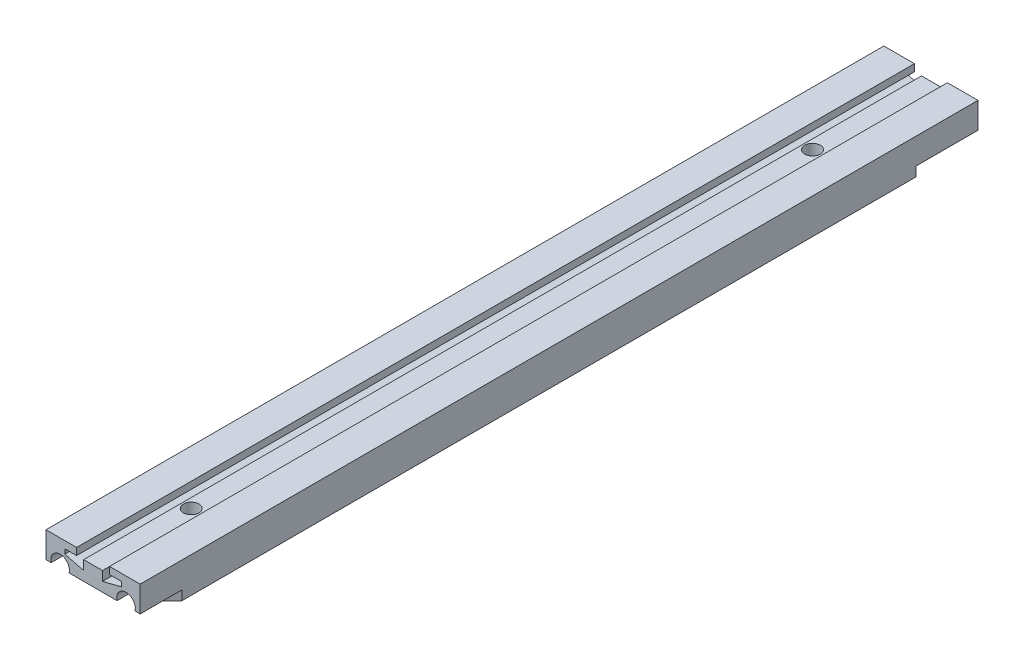
ISO-10303-21;
HEADER;
FILE_DESCRIPTION(('STEP AP214'),'2;1');
FILE_NAME('part.step','',(''),(''),'','','');
FILE_SCHEMA(('AUTOMOTIVE_DESIGN { 1 0 10303 214 1 1 1 1 }'));
ENDSEC;
DATA;
#1=APPLICATION_CONTEXT('core data for automotive mechanical design processes');
#2=APPLICATION_PROTOCOL_DEFINITION('international standard','automotive_design',2000,#1);
#3=PRODUCT_CONTEXT('',#1,'mechanical');
#4=PRODUCT('Part','Part','',(#3));
#5=PRODUCT_RELATED_PRODUCT_CATEGORY('part','',(#4));
#6=PRODUCT_DEFINITION_FORMATION('','',#4);
#7=PRODUCT_DEFINITION_CONTEXT('part definition',#1,'design');
#8=PRODUCT_DEFINITION('design','',#6,#7);
#9=PRODUCT_DEFINITION_SHAPE('','',#8);
#10=(LENGTH_UNIT() NAMED_UNIT(*) SI_UNIT(.MILLI.,.METRE.));
#11=(NAMED_UNIT(*) PLANE_ANGLE_UNIT() SI_UNIT($,.RADIAN.));
#12=(NAMED_UNIT(*) SI_UNIT($,.STERADIAN.) SOLID_ANGLE_UNIT());
#13=UNCERTAINTY_MEASURE_WITH_UNIT(LENGTH_MEASURE(1.E-05),#10,'distance_accuracy_value','');
#14=(GEOMETRIC_REPRESENTATION_CONTEXT(3) GLOBAL_UNCERTAINTY_ASSIGNED_CONTEXT((#13)) GLOBAL_UNIT_ASSIGNED_CONTEXT((#10,
#11,#12)) REPRESENTATION_CONTEXT('',''));
#15=CARTESIAN_POINT('',(0.,0.,0.));
#16=DIRECTION('',(0.,0.,1.));
#17=DIRECTION('',(1.,0.,0.));
#18=AXIS2_PLACEMENT_3D('',#15,#16,#17);
#19=CARTESIAN_POINT('',(0.,42.0000000000001,0.));
#20=DIRECTION('',(0.,1.,0.));
#21=DIRECTION('',(0.,0.,1.));
#22=AXIS2_PLACEMENT_3D('',#19,#20,#21);
#23=PLANE('',#22);
#24=DIRECTION('',(-1.,0.,0.));
#25=VECTOR('',#24,1.);
#26=CARTESIAN_POINT('',(-46.9999999999999,42.,-31.85));
#27=LINE('',#26,#25);
#28=CARTESIAN_POINT('',(-46.9999999999999,42.,-31.85));
#29=VERTEX_POINT('',#28);
#30=CARTESIAN_POINT('',(-49.8999999999999,42.,-31.85));
#31=VERTEX_POINT('',#30);
#32=EDGE_CURVE('E482',#29,#31,#27,.T.);
#33=ORIENTED_EDGE('',*,*,#32,.T.);
#34=DIRECTION('',(0.,0.,1.));
#35=VECTOR('',#34,1.);
#36=CARTESIAN_POINT('',(-49.8999999999999,42.,-43.));
#37=LINE('',#36,#35);
#38=CARTESIAN_POINT('',(-49.8999999999999,42.,128.15));
#39=VERTEX_POINT('',#38);
#40=EDGE_CURVE('E66',#31,#39,#37,.T.);
#41=ORIENTED_EDGE('',*,*,#40,.T.);
#42=DIRECTION('',(1.,0.,0.));
#43=VECTOR('',#42,1.);
#44=CARTESIAN_POINT('',(-62.9999999999999,42.,128.15));
#45=LINE('',#44,#43);
#46=CARTESIAN_POINT('',(-46.9999999999999,42.,128.15));
#47=VERTEX_POINT('',#46);
#48=EDGE_CURVE('E491',#39,#47,#45,.T.);
#49=ORIENTED_EDGE('',*,*,#48,.T.);
#50=DIRECTION('',(0.707106781186547,0.,-0.707106781186547));
#51=VECTOR('',#50,1.);
#52=CARTESIAN_POINT('',(-46.9999999999999,42.,128.15));
#53=LINE('',#52,#51);
#54=CARTESIAN_POINT('',(-46.0999999999999,42.,127.25));
#55=VERTEX_POINT('',#54);
#56=EDGE_CURVE('E488',#47,#55,#53,.T.);
#57=ORIENTED_EDGE('',*,*,#56,.T.);
#58=DIRECTION('',(0.,0.,1.));
#59=VECTOR('',#58,1.);
#60=CARTESIAN_POINT('',(-46.0999999999999,42.,-43.));
#61=LINE('',#60,#59);
#62=CARTESIAN_POINT('',(-46.0999999999999,42.,-30.95));
#63=VERTEX_POINT('',#62);
#64=EDGE_CURVE('E428',#63,#55,#61,.T.);
#65=ORIENTED_EDGE('',*,*,#64,.F.);
#66=DIRECTION('',(-0.707106781186549,0.,-0.707106781186546));
#67=VECTOR('',#66,1.);
#68=CARTESIAN_POINT('',(-44.9999999999999,42.,-29.85));
#69=LINE('',#68,#67);
#70=EDGE_CURVE('E484',#63,#29,#69,.T.);
#71=ORIENTED_EDGE('',*,*,#70,.T.);
#72=EDGE_LOOP('',(#33,#41,#49,#57,#65,#71));
#73=FACE_BOUND('',#72,.T.);
#74=ADVANCED_FACE('F41',(#73),#23,.T.);
#75=DIRECTION('',(0.,0.,1.));
#76=VECTOR('',#75,1.);
#77=CARTESIAN_POINT('',(-63.8999999999999,42.,-43.));
#78=LINE('',#77,#76);
#79=CARTESIAN_POINT('',(-63.8999999999999,42.,-30.95));
#80=VERTEX_POINT('',#79);
#81=CARTESIAN_POINT('',(-63.8999999999999,42.,127.25));
#82=VERTEX_POINT('',#81);
#83=EDGE_CURVE('E58',#80,#82,#78,.T.);
#84=ORIENTED_EDGE('',*,*,#83,.T.);
#85=DIRECTION('',(0.707106781186545,0.,0.70710678118655));
#86=VECTOR('',#85,1.);
#87=CARTESIAN_POINT('',(-64.9999999999999,42.,126.15));
#88=LINE('',#87,#86);
#89=CARTESIAN_POINT('',(-62.9999999999999,42.,128.15));
#90=VERTEX_POINT('',#89);
#91=EDGE_CURVE('E495',#82,#90,#88,.T.);
#92=ORIENTED_EDGE('',*,*,#91,.T.);
#93=CARTESIAN_POINT('',(-60.0999999999999,42.,128.15));
#94=VERTEX_POINT('',#93);
#95=EDGE_CURVE('E492',#90,#94,#45,.T.);
#96=ORIENTED_EDGE('',*,*,#95,.T.);
#97=DIRECTION('',(0.,0.,1.));
#98=VECTOR('',#97,1.);
#99=CARTESIAN_POINT('',(-60.0999999999999,42.,-43.));
#100=LINE('',#99,#98);
#101=CARTESIAN_POINT('',(-60.0999999999999,42.,-31.85));
#102=VERTEX_POINT('',#101);
#103=EDGE_CURVE('E385',#102,#94,#100,.T.);
#104=ORIENTED_EDGE('',*,*,#103,.F.);
#105=CARTESIAN_POINT('',(-62.9999999999999,42.,-31.85));
#106=VERTEX_POINT('',#105);
#107=EDGE_CURVE('E481',#102,#106,#27,.T.);
#108=ORIENTED_EDGE('',*,*,#107,.T.);
#109=DIRECTION('',(-0.707106781186545,0.,0.70710678118655));
#110=VECTOR('',#109,1.);
#111=CARTESIAN_POINT('',(-62.9999999999999,42.,-31.85));
#112=LINE('',#111,#110);
#113=EDGE_CURVE('E461',#106,#80,#112,.T.);
#114=ORIENTED_EDGE('',*,*,#113,.T.);
#115=EDGE_LOOP('',(#84,#92,#96,#104,#108,#114));
#116=FACE_BOUND('',#115,.T.);
#117=ADVANCED_FACE('F524',(#116),#23,.T.);
#118=CARTESIAN_POINT('',(0.,40.0000000000001,0.));
#119=DIRECTION('',(0.,1.,0.));
#120=DIRECTION('',(0.,0.,1.));
#121=AXIS2_PLACEMENT_3D('',#118,#119,#120);
#122=PLANE('',#121);
#123=DIRECTION('',(0.707106781186545,0.,0.70710678118655));
#124=VECTOR('',#123,1.);
#125=CARTESIAN_POINT('',(-64.9999999999999,40.,126.15));
#126=LINE('',#125,#124);
#127=CARTESIAN_POINT('',(-64.9999999999999,40.,126.15));
#128=VERTEX_POINT('',#127);
#129=CARTESIAN_POINT('',(-62.9999999999999,40.,128.15));
#130=VERTEX_POINT('',#129);
#131=EDGE_CURVE('E477',#128,#130,#126,.T.);
#132=ORIENTED_EDGE('',*,*,#131,.F.);
#133=DIRECTION('',(0.,0.,1.));
#134=VECTOR('',#133,1.);
#135=CARTESIAN_POINT('',(-64.9999999999999,40.,-29.85));
#136=LINE('',#135,#134);
#137=CARTESIAN_POINT('',(-64.9999999999999,40.,-29.85));
#138=VERTEX_POINT('',#137);
#139=EDGE_CURVE('E462',#138,#128,#136,.T.);
#140=ORIENTED_EDGE('',*,*,#139,.F.);
#141=DIRECTION('',(-0.707106781186545,0.,0.70710678118655));
#142=VECTOR('',#141,1.);
#143=CARTESIAN_POINT('',(-62.9999999999999,40.,-31.85));
#144=LINE('',#143,#142);
#145=CARTESIAN_POINT('',(-62.9999999999999,40.,-31.85));
#146=VERTEX_POINT('',#145);
#147=EDGE_CURVE('E464',#146,#138,#144,.T.);
#148=ORIENTED_EDGE('',*,*,#147,.F.);
#149=DIRECTION('',(-1.,0.,0.));
#150=VECTOR('',#149,1.);
#151=CARTESIAN_POINT('',(-46.9999999999999,40.,-31.85));
#152=LINE('',#151,#150);
#153=CARTESIAN_POINT('',(-46.9999999999999,40.,-31.85));
#154=VERTEX_POINT('',#153);
#155=EDGE_CURVE('E467',#154,#146,#152,.T.);
#156=ORIENTED_EDGE('',*,*,#155,.F.);
#157=DIRECTION('',(-0.707106781186549,0.,-0.707106781186546));
#158=VECTOR('',#157,1.);
#159=CARTESIAN_POINT('',(-44.9999999999999,40.,-29.85));
#160=LINE('',#159,#158);
#161=CARTESIAN_POINT('',(-44.9999999999999,40.,-29.85));
#162=VERTEX_POINT('',#161);
#163=EDGE_CURVE('E469',#162,#154,#160,.T.);
#164=ORIENTED_EDGE('',*,*,#163,.F.);
#165=DIRECTION('',(0.,0.,-1.));
#166=VECTOR('',#165,1.);
#167=CARTESIAN_POINT('',(-44.9999999999999,40.,126.15));
#168=LINE('',#167,#166);
#169=CARTESIAN_POINT('',(-44.9999999999999,40.,126.15));
#170=VERTEX_POINT('',#169);
#171=EDGE_CURVE('E471',#170,#162,#168,.T.);
#172=ORIENTED_EDGE('',*,*,#171,.F.);
#173=DIRECTION('',(0.707106781186547,0.,-0.707106781186547));
#174=VECTOR('',#173,1.);
#175=CARTESIAN_POINT('',(-46.9999999999999,40.,128.15));
#176=LINE('',#175,#174);
#177=CARTESIAN_POINT('',(-46.9999999999999,40.,128.15));
#178=VERTEX_POINT('',#177);
#179=EDGE_CURVE('E473',#178,#170,#176,.T.);
#180=ORIENTED_EDGE('',*,*,#179,.F.);
#181=DIRECTION('',(1.,0.,0.));
#182=VECTOR('',#181,1.);
#183=CARTESIAN_POINT('',(-62.9999999999999,40.,128.15));
#184=LINE('',#183,#182);
#185=EDGE_CURVE('E475',#130,#178,#184,.T.);
#186=ORIENTED_EDGE('',*,*,#185,.F.);
#187=EDGE_LOOP('',(#132,#140,#148,#156,#164,#172,#180,#186));
#188=FACE_BOUND('',#187,.T.);
#189=CARTESIAN_POINT('',(-54.9999999999999,40.,-17.85));
#190=DIRECTION('',(0.,1.,0.));
#191=DIRECTION('',(-1.,0.,0.));
#192=AXIS2_PLACEMENT_3D('',#189,#190,#191);
#193=CIRCLE('',#192,1.65);
#194=CARTESIAN_POINT('',(-56.6499999999999,40.,-17.85));
#195=VERTEX_POINT('',#194);
#196=EDGE_CURVE('E50',#195,#195,#193,.T.);
#197=ORIENTED_EDGE('',*,*,#196,.T.);
#198=EDGE_LOOP('',(#197));
#199=FACE_BOUND('',#198,.T.);
#200=CARTESIAN_POINT('',(-54.9999999999999,40.,114.15));
#201=DIRECTION('',(0.,1.,0.));
#202=DIRECTION('',(-1.,0.,0.));
#203=AXIS2_PLACEMENT_3D('',#200,#201,#202);
#204=CIRCLE('',#203,1.65);
#205=CARTESIAN_POINT('',(-56.6499999999999,40.,114.15));
#206=VERTEX_POINT('',#205);
#207=EDGE_CURVE('E11',#206,#206,#204,.T.);
#208=ORIENTED_EDGE('',*,*,#207,.T.);
#209=EDGE_LOOP('',(#208));
#210=FACE_BOUND('',#209,.T.);
#211=ADVANCED_FACE('F530',(#188,#199,#210),#122,.F.);
#212=CARTESIAN_POINT('',(-64.9999999999999,42.,126.15));
#213=DIRECTION('',(0.70710678118655,0.,-0.707106781186545));
#214=DIRECTION('',(-0.707106781186545,0.,-0.70710678118655));
#215=AXIS2_PLACEMENT_3D('',#212,#213,#214);
#216=PLANE('',#215);
#217=ORIENTED_EDGE('',*,*,#131,.T.);
#218=DIRECTION('',(0.,-1.,0.));
#219=VECTOR('',#218,1.);
#220=CARTESIAN_POINT('',(-62.9999999999999,42.,128.15));
#221=LINE('',#220,#219);
#222=EDGE_CURVE('E437',#90,#130,#221,.T.);
#223=ORIENTED_EDGE('',*,*,#222,.F.);
#224=ORIENTED_EDGE('',*,*,#91,.F.);
#225=CARTESIAN_POINT('',(-64.9999999999999,42.,126.15));
#226=VERTEX_POINT('',#225);
#227=EDGE_CURVE('E465',#226,#82,#88,.T.);
#228=ORIENTED_EDGE('',*,*,#227,.F.);
#229=DIRECTION('',(0.,-1.,0.));
#230=VECTOR('',#229,1.);
#231=CARTESIAN_POINT('',(-64.9999999999999,42.,126.15));
#232=LINE('',#231,#230);
#233=EDGE_CURVE('E458',#226,#128,#232,.T.);
#234=ORIENTED_EDGE('',*,*,#233,.T.);
#235=EDGE_LOOP('',(#217,#223,#224,#228,#234));
#236=FACE_BOUND('',#235,.T.);
#237=ADVANCED_FACE('F534',(#236),#216,.F.);
#238=CARTESIAN_POINT('',(-62.9999999999999,42.,128.15));
#239=DIRECTION('',(0.,0.,-1.));
#240=DIRECTION('',(-1.,0.,0.));
#241=AXIS2_PLACEMENT_3D('',#238,#239,#240);
#242=PLANE('',#241);
#243=ORIENTED_EDGE('',*,*,#185,.T.);
#244=DIRECTION('',(0.,-1.,0.));
#245=VECTOR('',#244,1.);
#246=CARTESIAN_POINT('',(-46.9999999999999,42.,128.15));
#247=LINE('',#246,#245);
#248=EDGE_CURVE('E440',#47,#178,#247,.T.);
#249=ORIENTED_EDGE('',*,*,#248,.F.);
#250=ORIENTED_EDGE('',*,*,#48,.F.);
#251=DIRECTION('',(-1.,0.,0.));
#252=VECTOR('',#251,1.);
#253=CARTESIAN_POINT('',(-62.9999999999999,42.,128.15));
#254=LINE('',#253,#252);
#255=EDGE_CURVE('E260',#39,#94,#254,.T.);
#256=ORIENTED_EDGE('',*,*,#255,.T.);
#257=ORIENTED_EDGE('',*,*,#95,.F.);
#258=ORIENTED_EDGE('',*,*,#222,.T.);
#259=EDGE_LOOP('',(#243,#249,#250,#256,#257,#258));
#260=FACE_BOUND('',#259,.T.);
#261=ADVANCED_FACE('F558',(#260),#242,.F.);
#262=CARTESIAN_POINT('',(-46.9999999999999,42.,128.15));
#263=DIRECTION('',(-0.707106781186547,0.,-0.707106781186547));
#264=DIRECTION('',(-0.707106781186548,0.,0.707106781186548));
#265=AXIS2_PLACEMENT_3D('',#262,#263,#264);
#266=PLANE('',#265);
#267=ORIENTED_EDGE('',*,*,#179,.T.);
#268=DIRECTION('',(0.,-1.,0.));
#269=VECTOR('',#268,1.);
#270=CARTESIAN_POINT('',(-44.9999999999999,42.,126.15));
#271=LINE('',#270,#269);
#272=CARTESIAN_POINT('',(-44.9999999999999,42.,126.15));
#273=VERTEX_POINT('',#272);
#274=EDGE_CURVE('E443',#273,#170,#271,.T.);
#275=ORIENTED_EDGE('',*,*,#274,.F.);
#276=DIRECTION('',(-0.707106781186548,0.,0.707106781186548));
#277=VECTOR('',#276,1.);
#278=CARTESIAN_POINT('',(-46.9999999999999,42.,128.15));
#279=LINE('',#278,#277);
#280=EDGE_CURVE('E435',#273,#55,#279,.T.);
#281=ORIENTED_EDGE('',*,*,#280,.T.);
#282=ORIENTED_EDGE('',*,*,#56,.F.);
#283=ORIENTED_EDGE('',*,*,#248,.T.);
#284=EDGE_LOOP('',(#267,#275,#281,#282,#283));
#285=FACE_BOUND('',#284,.T.);
#286=ADVANCED_FACE('F554',(#285),#266,.F.);
#287=CARTESIAN_POINT('',(-44.9999999999999,42.,126.15));
#288=DIRECTION('',(-1.,0.,0.));
#289=DIRECTION('',(0.,-1.,0.));
#290=AXIS2_PLACEMENT_3D('',#287,#288,#289);
#291=PLANE('',#290);
#292=ORIENTED_EDGE('',*,*,#171,.T.);
#293=DIRECTION('',(0.,-1.,0.));
#294=VECTOR('',#293,1.);
#295=CARTESIAN_POINT('',(-44.9999999999999,42.,-29.85));
#296=LINE('',#295,#294);
#297=CARTESIAN_POINT('',(-44.9999999999999,42.,-29.85));
#298=VERTEX_POINT('',#297);
#299=EDGE_CURVE('E446',#298,#162,#296,.T.);
#300=ORIENTED_EDGE('',*,*,#299,.F.);
#301=DIRECTION('',(0.,0.,1.));
#302=VECTOR('',#301,1.);
#303=CARTESIAN_POINT('',(-44.9999999999999,42.,-43.));
#304=LINE('',#303,#302);
#305=CARTESIAN_POINT('',(-44.9999999999999,42.,-43.));
#306=VERTEX_POINT('',#305);
#307=EDGE_CURVE('E423',#306,#298,#304,.T.);
#308=ORIENTED_EDGE('',*,*,#307,.F.);
#309=DIRECTION('',(0.,1.,0.));
#310=VECTOR('',#309,1.);
#311=CARTESIAN_POINT('',(-44.9999999999998,0.,-43.));
#312=LINE('',#311,#310);
#313=CARTESIAN_POINT('',(-44.9999999999999,47.5,-43.));
#314=VERTEX_POINT('',#313);
#315=EDGE_CURVE('E342',#306,#314,#312,.T.);
#316=ORIENTED_EDGE('',*,*,#315,.T.);
#317=DIRECTION('',(0.,0.,1.));
#318=VECTOR('',#317,1.);
#319=CARTESIAN_POINT('',(-44.9999999999999,47.5,-43.));
#320=LINE('',#319,#318);
#321=CARTESIAN_POINT('',(-44.9999999999999,47.5,135.));
#322=VERTEX_POINT('',#321);
#323=EDGE_CURVE('E421',#314,#322,#320,.T.);
#324=ORIENTED_EDGE('',*,*,#323,.T.);
#325=DIRECTION('',(0.,1.,0.));
#326=VECTOR('',#325,1.);
#327=CARTESIAN_POINT('',(-44.9999999999998,0.,135.));
#328=LINE('',#327,#326);
#329=CARTESIAN_POINT('',(-44.9999999999999,42.,135.));
#330=VERTEX_POINT('',#329);
#331=EDGE_CURVE('E285',#330,#322,#328,.T.);
#332=ORIENTED_EDGE('',*,*,#331,.F.);
#333=EDGE_CURVE('E426',#273,#330,#304,.T.);
#334=ORIENTED_EDGE('',*,*,#333,.F.);
#335=ORIENTED_EDGE('',*,*,#274,.T.);
#336=EDGE_LOOP('',(#292,#300,#308,#316,#324,#332,#334,#335));
#337=FACE_BOUND('',#336,.T.);
#338=ADVANCED_FACE('F550',(#337),#291,.F.);
#339=CARTESIAN_POINT('',(-44.9999999999999,42.,-29.85));
#340=DIRECTION('',(-0.707106781186546,0.,0.707106781186549));
#341=DIRECTION('',(0.707106781186549,0.,0.707106781186546));
#342=AXIS2_PLACEMENT_3D('',#339,#340,#341);
#343=PLANE('',#342);
#344=ORIENTED_EDGE('',*,*,#163,.T.);
#345=DIRECTION('',(0.,-1.,0.));
#346=VECTOR('',#345,1.);
#347=CARTESIAN_POINT('',(-46.9999999999999,42.,-31.85));
#348=LINE('',#347,#346);
#349=EDGE_CURVE('E449',#29,#154,#348,.T.);
#350=ORIENTED_EDGE('',*,*,#349,.F.);
#351=ORIENTED_EDGE('',*,*,#70,.F.);
#352=EDGE_CURVE('E485',#298,#63,#69,.T.);
#353=ORIENTED_EDGE('',*,*,#352,.F.);
#354=ORIENTED_EDGE('',*,*,#299,.T.);
#355=EDGE_LOOP('',(#344,#350,#351,#353,#354));
#356=FACE_BOUND('',#355,.T.);
#357=ADVANCED_FACE('F546',(#356),#343,.F.);
#358=CARTESIAN_POINT('',(-46.9999999999999,42.,-31.85));
#359=DIRECTION('',(0.,0.,1.));
#360=DIRECTION('',(1.,0.,0.));
#361=AXIS2_PLACEMENT_3D('',#358,#359,#360);
#362=PLANE('',#361);
#363=ORIENTED_EDGE('',*,*,#155,.T.);
#364=DIRECTION('',(0.,-1.,0.));
#365=VECTOR('',#364,1.);
#366=CARTESIAN_POINT('',(-62.9999999999999,42.,-31.85));
#367=LINE('',#366,#365);
#368=EDGE_CURVE('E452',#106,#146,#367,.T.);
#369=ORIENTED_EDGE('',*,*,#368,.F.);
#370=ORIENTED_EDGE('',*,*,#107,.F.);
#371=DIRECTION('',(1.,0.,0.));
#372=VECTOR('',#371,1.);
#373=CARTESIAN_POINT('',(-46.9999999999999,42.,-31.85));
#374=LINE('',#373,#372);
#375=EDGE_CURVE('E384',#102,#31,#374,.T.);
#376=ORIENTED_EDGE('',*,*,#375,.T.);
#377=ORIENTED_EDGE('',*,*,#32,.F.);
#378=ORIENTED_EDGE('',*,*,#349,.T.);
#379=EDGE_LOOP('',(#363,#369,#370,#376,#377,#378));
#380=FACE_BOUND('',#379,.T.);
#381=ADVANCED_FACE('F542',(#380),#362,.F.);
#382=CARTESIAN_POINT('',(-62.9999999999999,42.,-31.85));
#383=DIRECTION('',(0.70710678118655,0.,0.707106781186545));
#384=DIRECTION('',(0.707106781186545,0.,-0.70710678118655));
#385=AXIS2_PLACEMENT_3D('',#382,#383,#384);
#386=PLANE('',#385);
#387=ORIENTED_EDGE('',*,*,#147,.T.);
#388=DIRECTION('',(0.,-1.,0.));
#389=VECTOR('',#388,1.);
#390=CARTESIAN_POINT('',(-64.9999999999999,42.,-29.85));
#391=LINE('',#390,#389);
#392=CARTESIAN_POINT('',(-64.9999999999999,42.,-29.85));
#393=VERTEX_POINT('',#392);
#394=EDGE_CURVE('E455',#393,#138,#391,.T.);
#395=ORIENTED_EDGE('',*,*,#394,.F.);
#396=DIRECTION('',(0.707106781186545,0.,-0.70710678118655));
#397=VECTOR('',#396,1.);
#398=CARTESIAN_POINT('',(-62.9999999999999,42.,-31.85));
#399=LINE('',#398,#397);
#400=EDGE_CURVE('E433',#393,#80,#399,.T.);
#401=ORIENTED_EDGE('',*,*,#400,.T.);
#402=ORIENTED_EDGE('',*,*,#113,.F.);
#403=ORIENTED_EDGE('',*,*,#368,.T.);
#404=EDGE_LOOP('',(#387,#395,#401,#402,#403));
#405=FACE_BOUND('',#404,.T.);
#406=ADVANCED_FACE('F538',(#405),#386,.F.);
#407=CARTESIAN_POINT('',(-64.9999999999999,42.,-29.85));
#408=DIRECTION('',(1.,0.,0.));
#409=DIRECTION('',(0.,1.,0.));
#410=AXIS2_PLACEMENT_3D('',#407,#408,#409);
#411=PLANE('',#410);
#412=ORIENTED_EDGE('',*,*,#139,.T.);
#413=ORIENTED_EDGE('',*,*,#233,.F.);
#414=DIRECTION('',(0.,0.,1.));
#415=VECTOR('',#414,1.);
#416=CARTESIAN_POINT('',(-64.9999999999999,42.,-43.));
#417=LINE('',#416,#415);
#418=CARTESIAN_POINT('',(-64.9999999999999,42.,135.));
#419=VERTEX_POINT('',#418);
#420=EDGE_CURVE('E394',#226,#419,#417,.T.);
#421=ORIENTED_EDGE('',*,*,#420,.T.);
#422=DIRECTION('',(0.,1.,0.));
#423=VECTOR('',#422,1.);
#424=CARTESIAN_POINT('',(-64.9999999999999,0.,135.));
#425=LINE('',#424,#423);
#426=CARTESIAN_POINT('',(-64.9999999999999,47.5,135.));
#427=VERTEX_POINT('',#426);
#428=EDGE_CURVE('E329',#419,#427,#425,.T.);
#429=ORIENTED_EDGE('',*,*,#428,.T.);
#430=DIRECTION('',(0.,0.,1.));
#431=VECTOR('',#430,1.);
#432=CARTESIAN_POINT('',(-64.9999999999999,47.5,-43.));
#433=LINE('',#432,#431);
#434=CARTESIAN_POINT('',(-64.9999999999999,47.5,-43.));
#435=VERTEX_POINT('',#434);
#436=EDGE_CURVE('E395',#435,#427,#433,.T.);
#437=ORIENTED_EDGE('',*,*,#436,.F.);
#438=DIRECTION('',(0.,1.,0.));
#439=VECTOR('',#438,1.);
#440=CARTESIAN_POINT('',(-64.9999999999999,0.,-43.));
#441=LINE('',#440,#439);
#442=CARTESIAN_POINT('',(-64.9999999999999,42.,-43.));
#443=VERTEX_POINT('',#442);
#444=EDGE_CURVE('E377',#443,#435,#441,.T.);
#445=ORIENTED_EDGE('',*,*,#444,.F.);
#446=EDGE_CURVE('E391',#443,#393,#417,.T.);
#447=ORIENTED_EDGE('',*,*,#446,.T.);
#448=ORIENTED_EDGE('',*,*,#394,.T.);
#449=EDGE_LOOP('',(#412,#413,#421,#429,#437,#445,#447,#448));
#450=FACE_BOUND('',#449,.T.);
#451=ADVANCED_FACE('F520',(#450),#411,.F.);
#452=CARTESIAN_POINT('',(-54.9999999999999,42.,-17.85));
#453=DIRECTION('',(0.,-1.,0.));
#454=DIRECTION('',(1.,0.,0.));
#455=AXIS2_PLACEMENT_3D('',#452,#453,#454);
#456=CYLINDRICAL_SURFACE('',#455,1.65);
#457=ORIENTED_EDGE('',*,*,#196,.F.);
#458=EDGE_LOOP('',(#457));
#459=FACE_BOUND('',#458,.T.);
#460=CARTESIAN_POINT('',(-54.9999999999999,46.,-17.85));
#461=DIRECTION('',(0.,-1.,0.));
#462=DIRECTION('',(0.,0.,-1.));
#463=AXIS2_PLACEMENT_3D('',#460,#461,#462);
#464=CIRCLE('',#463,1.65);
#465=CARTESIAN_POINT('',(-54.9999999999999,46.,-19.5));
#466=VERTEX_POINT('',#465);
#467=EDGE_CURVE('E499',#466,#466,#464,.T.);
#468=ORIENTED_EDGE('',*,*,#467,.F.);
#469=EDGE_LOOP('',(#468));
#470=FACE_BOUND('',#469,.T.);
#471=ADVANCED_FACE('F510',(#459,#470),#456,.F.);
#472=CARTESIAN_POINT('',(-54.9999999999999,42.,114.15));
#473=DIRECTION('',(0.,-1.,0.));
#474=DIRECTION('',(1.,0.,0.));
#475=AXIS2_PLACEMENT_3D('',#472,#473,#474);
#476=CYLINDRICAL_SURFACE('',#475,1.65);
#477=ORIENTED_EDGE('',*,*,#207,.F.);
#478=EDGE_LOOP('',(#477));
#479=FACE_BOUND('',#478,.T.);
#480=CARTESIAN_POINT('',(-54.9999999999999,46.,114.15));
#481=DIRECTION('',(0.,-1.,0.));
#482=DIRECTION('',(0.,0.,-1.));
#483=AXIS2_PLACEMENT_3D('',#480,#481,#482);
#484=CIRCLE('',#483,1.65);
#485=CARTESIAN_POINT('',(-54.9999999999999,46.,112.5));
#486=VERTEX_POINT('',#485);
#487=EDGE_CURVE('E45',#486,#486,#484,.T.);
#488=ORIENTED_EDGE('',*,*,#487,.F.);
#489=EDGE_LOOP('',(#488));
#490=FACE_BOUND('',#489,.T.);
#491=ADVANCED_FACE('F43',(#479,#490),#476,.F.);
#492=CARTESIAN_POINT('',(0.,41.9999999999999,-43.));
#493=DIRECTION('',(0.,-1.,0.));
#494=DIRECTION('',(1.,0.,0.));
#495=AXIS2_PLACEMENT_3D('',#492,#493,#494);
#496=PLANE('',#495);
#497=ORIENTED_EDGE('',*,*,#280,.F.);
#498=ORIENTED_EDGE('',*,*,#333,.T.);
#499=DIRECTION('',(1.,0.,0.));
#500=VECTOR('',#499,1.);
#501=CARTESIAN_POINT('',(0.,41.9999999999999,135.));
#502=LINE('',#501,#500);
#503=CARTESIAN_POINT('',(-46.0999999999999,42.,135.));
#504=VERTEX_POINT('',#503);
#505=EDGE_CURVE('E283',#504,#330,#502,.T.);
#506=ORIENTED_EDGE('',*,*,#505,.F.);
#507=EDGE_CURVE('E281',#55,#504,#61,.T.);
#508=ORIENTED_EDGE('',*,*,#507,.F.);
#509=EDGE_LOOP('',(#497,#498,#506,#508));
#510=FACE_BOUND('',#509,.T.);
#511=ADVANCED_FACE('F509',(#510),#496,.T.);
#512=ORIENTED_EDGE('',*,*,#352,.T.);
#513=CARTESIAN_POINT('',(-46.0999999999999,42.,-43.));
#514=VERTEX_POINT('',#513);
#515=EDGE_CURVE('E427',#514,#63,#61,.T.);
#516=ORIENTED_EDGE('',*,*,#515,.F.);
#517=DIRECTION('',(1.,0.,0.));
#518=VECTOR('',#517,1.);
#519=CARTESIAN_POINT('',(0.,41.9999999999999,-43.));
#520=LINE('',#519,#518);
#521=EDGE_CURVE('E339',#514,#306,#520,.T.);
#522=ORIENTED_EDGE('',*,*,#521,.T.);
#523=ORIENTED_EDGE('',*,*,#307,.T.);
#524=EDGE_LOOP('',(#512,#516,#522,#523));
#525=FACE_BOUND('',#524,.T.);
#526=ADVANCED_FACE('F516',(#525),#496,.T.);
#527=CARTESIAN_POINT('',(0.,41.9999999999999,-43.));
#528=DIRECTION('',(0.,-1.,0.));
#529=DIRECTION('',(1.,0.,0.));
#530=AXIS2_PLACEMENT_3D('',#527,#528,#529);
#531=PLANE('',#530);
#532=ORIENTED_EDGE('',*,*,#227,.T.);
#533=CARTESIAN_POINT('',(-63.8999999999999,42.,135.));
#534=VERTEX_POINT('',#533);
#535=EDGE_CURVE('E390',#82,#534,#78,.T.);
#536=ORIENTED_EDGE('',*,*,#535,.T.);
#537=DIRECTION('',(1.,0.,0.));
#538=VECTOR('',#537,1.);
#539=CARTESIAN_POINT('',(0.,41.9999999999999,135.));
#540=LINE('',#539,#538);
#541=EDGE_CURVE('E276',#419,#534,#540,.T.);
#542=ORIENTED_EDGE('',*,*,#541,.F.);
#543=ORIENTED_EDGE('',*,*,#420,.F.);
#544=EDGE_LOOP('',(#532,#536,#542,#543));
#545=FACE_BOUND('',#544,.T.);
#546=ADVANCED_FACE('F620',(#545),#531,.T.);
#547=ORIENTED_EDGE('',*,*,#400,.F.);
#548=ORIENTED_EDGE('',*,*,#446,.F.);
#549=DIRECTION('',(1.,0.,0.));
#550=VECTOR('',#549,1.);
#551=CARTESIAN_POINT('',(0.,41.9999999999999,-43.));
#552=LINE('',#551,#550);
#553=CARTESIAN_POINT('',(-63.8999999999999,42.,-43.));
#554=VERTEX_POINT('',#553);
#555=EDGE_CURVE('E337',#443,#554,#552,.T.);
#556=ORIENTED_EDGE('',*,*,#555,.T.);
#557=EDGE_CURVE('E387',#554,#80,#78,.T.);
#558=ORIENTED_EDGE('',*,*,#557,.T.);
#559=EDGE_LOOP('',(#547,#548,#556,#558));
#560=FACE_BOUND('',#559,.T.);
#561=ADVANCED_FACE('F623',(#560),#531,.T.);
#562=ORIENTED_EDGE('',*,*,#255,.F.);
#563=CARTESIAN_POINT('',(-49.8999999999999,42.,135.));
#564=VERTEX_POINT('',#563);
#565=EDGE_CURVE('E255',#39,#564,#37,.T.);
#566=ORIENTED_EDGE('',*,*,#565,.T.);
#567=CARTESIAN_POINT('',(-60.0999999999999,42.,135.));
#568=VERTEX_POINT('',#567);
#569=EDGE_CURVE('E259',#568,#564,#540,.T.);
#570=ORIENTED_EDGE('',*,*,#569,.F.);
#571=EDGE_CURVE('E386',#94,#568,#100,.T.);
#572=ORIENTED_EDGE('',*,*,#571,.F.);
#573=EDGE_LOOP('',(#562,#566,#570,#572));
#574=FACE_BOUND('',#573,.T.);
#575=ADVANCED_FACE('F257',(#574),#531,.T.);
#576=ORIENTED_EDGE('',*,*,#375,.F.);
#577=CARTESIAN_POINT('',(-60.0999999999999,42.,-43.));
#578=VERTEX_POINT('',#577);
#579=EDGE_CURVE('E381',#578,#102,#100,.T.);
#580=ORIENTED_EDGE('',*,*,#579,.F.);
#581=CARTESIAN_POINT('',(-49.8999999999999,42.,-43.));
#582=VERTEX_POINT('',#581);
#583=EDGE_CURVE('E333',#578,#582,#552,.T.);
#584=ORIENTED_EDGE('',*,*,#583,.T.);
#585=EDGE_CURVE('E265',#582,#31,#37,.T.);
#586=ORIENTED_EDGE('',*,*,#585,.T.);
#587=EDGE_LOOP('',(#576,#580,#584,#586));
#588=FACE_BOUND('',#587,.T.);
#589=ADVANCED_FACE('F625',(#588),#531,.T.);
#590=CARTESIAN_POINT('',(-61.9999999999999,42.528,-43.));
#591=DIRECTION('',(0.,0.,1.));
#592=DIRECTION('',(1.,0.,0.));
#593=AXIS2_PLACEMENT_3D('',#590,#591,#592);
#594=CYLINDRICAL_SURFACE('',#593,1.972);
#595=ORIENTED_EDGE('',*,*,#579,.T.);
#596=ORIENTED_EDGE('',*,*,#103,.T.);
#597=ORIENTED_EDGE('',*,*,#571,.T.);
#598=CARTESIAN_POINT('',(-61.9999999999999,42.528,135.));
#599=DIRECTION('',(0.,0.,1.));
#600=DIRECTION('',(1.,0.,0.));
#601=AXIS2_PLACEMENT_3D('',#598,#599,#600);
#602=CIRCLE('',#601,1.972);
#603=EDGE_CURVE('E274',#534,#568,#602,.F.);
#604=ORIENTED_EDGE('',*,*,#603,.F.);
#605=ORIENTED_EDGE('',*,*,#535,.F.);
#606=ORIENTED_EDGE('',*,*,#83,.F.);
#607=ORIENTED_EDGE('',*,*,#557,.F.);
#608=CARTESIAN_POINT('',(-61.9999999999999,42.528,-43.));
#609=DIRECTION('',(0.,0.,1.));
#610=DIRECTION('',(1.,0.,0.));
#611=AXIS2_PLACEMENT_3D('',#608,#609,#610);
#612=CIRCLE('',#611,1.972);
#613=EDGE_CURVE('E263',#554,#578,#612,.F.);
#614=ORIENTED_EDGE('',*,*,#613,.T.);
#615=EDGE_LOOP('',(#595,#596,#597,#604,#605,#606,#607,#614));
#616=FACE_BOUND('',#615,.T.);
#617=ADVANCED_FACE('F618',(#616),#594,.F.);
#618=CARTESIAN_POINT('',(0.,47.5,-43.));
#619=DIRECTION('',(0.,-1.,0.));
#620=DIRECTION('',(0.,0.,-1.));
#621=AXIS2_PLACEMENT_3D('',#618,#619,#620);
#622=PLANE('',#621);
#623=ORIENTED_EDGE('',*,*,#436,.T.);
#624=DIRECTION('',(1.,0.,0.));
#625=VECTOR('',#624,1.);
#626=CARTESIAN_POINT('',(0.,47.5,135.));
#627=LINE('',#626,#625);
#628=CARTESIAN_POINT('',(-58.4999999999999,47.5,135.));
#629=VERTEX_POINT('',#628);
#630=EDGE_CURVE('E326',#427,#629,#627,.T.);
#631=ORIENTED_EDGE('',*,*,#630,.T.);
#632=DIRECTION('',(0.,0.,1.));
#633=VECTOR('',#632,1.);
#634=CARTESIAN_POINT('',(-58.4999999999999,47.5,-43.));
#635=LINE('',#634,#633);
#636=CARTESIAN_POINT('',(-58.4999999999999,47.5,-43.));
#637=VERTEX_POINT('',#636);
#638=EDGE_CURVE('E397',#637,#629,#635,.T.);
#639=ORIENTED_EDGE('',*,*,#638,.F.);
#640=DIRECTION('',(1.,0.,0.));
#641=VECTOR('',#640,1.);
#642=CARTESIAN_POINT('',(0.,47.5,-43.));
#643=LINE('',#642,#641);
#644=EDGE_CURVE('E375',#435,#637,#643,.T.);
#645=ORIENTED_EDGE('',*,*,#644,.F.);
#646=EDGE_LOOP('',(#623,#631,#639,#645));
#647=FACE_BOUND('',#646,.T.);
#648=ADVANCED_FACE('F614',(#647),#622,.F.);
#649=CARTESIAN_POINT('',(-58.4999999999999,0.,-43.));
#650=DIRECTION('',(-1.,0.,0.));
#651=DIRECTION('',(0.,0.,1.));
#652=AXIS2_PLACEMENT_3D('',#649,#650,#651);
#653=PLANE('',#652);
#654=ORIENTED_EDGE('',*,*,#638,.T.);
#655=DIRECTION('',(0.,-1.,0.));
#656=VECTOR('',#655,1.);
#657=CARTESIAN_POINT('',(-58.4999999999999,0.,135.));
#658=LINE('',#657,#656);
#659=CARTESIAN_POINT('',(-58.4999999999999,46.,135.));
#660=VERTEX_POINT('',#659);
#661=EDGE_CURVE('E323',#629,#660,#658,.T.);
#662=ORIENTED_EDGE('',*,*,#661,.T.);
#663=DIRECTION('',(0.,0.,1.));
#664=VECTOR('',#663,1.);
#665=CARTESIAN_POINT('',(-58.4999999999999,46.,-43.));
#666=LINE('',#665,#664);
#667=CARTESIAN_POINT('',(-58.4999999999999,46.,-43.));
#668=VERTEX_POINT('',#667);
#669=EDGE_CURVE('E399',#668,#660,#666,.T.);
#670=ORIENTED_EDGE('',*,*,#669,.F.);
#671=DIRECTION('',(0.,-1.,0.));
#672=VECTOR('',#671,1.);
#673=CARTESIAN_POINT('',(-58.4999999999999,0.,-43.));
#674=LINE('',#673,#672);
#675=EDGE_CURVE('E373',#637,#668,#674,.T.);
#676=ORIENTED_EDGE('',*,*,#675,.F.);
#677=EDGE_LOOP('',(#654,#662,#670,#676));
#678=FACE_BOUND('',#677,.T.);
#679=ADVANCED_FACE('F610',(#678),#653,.F.);
#680=CARTESIAN_POINT('',(0.,46.,-43.));
#681=DIRECTION('',(0.,1.,0.));
#682=DIRECTION('',(0.,0.,1.));
#683=AXIS2_PLACEMENT_3D('',#680,#681,#682);
#684=PLANE('',#683);
#685=ORIENTED_EDGE('',*,*,#669,.T.);
#686=DIRECTION('',(-1.,0.,0.));
#687=VECTOR('',#686,1.);
#688=CARTESIAN_POINT('',(0.,46.,135.));
#689=LINE('',#688,#687);
#690=CARTESIAN_POINT('',(-60.9999999999999,46.,135.));
#691=VERTEX_POINT('',#690);
#692=EDGE_CURVE('E320',#660,#691,#689,.T.);
#693=ORIENTED_EDGE('',*,*,#692,.T.);
#694=DIRECTION('',(0.,0.,1.));
#695=VECTOR('',#694,1.);
#696=CARTESIAN_POINT('',(-60.9999999999999,46.,-43.));
#697=LINE('',#696,#695);
#698=CARTESIAN_POINT('',(-60.9999999999999,46.,-43.));
#699=VERTEX_POINT('',#698);
#700=EDGE_CURVE('E401',#699,#691,#697,.T.);
#701=ORIENTED_EDGE('',*,*,#700,.F.);
#702=DIRECTION('',(-1.,0.,0.));
#703=VECTOR('',#702,1.);
#704=CARTESIAN_POINT('',(0.,46.,-43.));
#705=LINE('',#704,#703);
#706=EDGE_CURVE('E371',#668,#699,#705,.T.);
#707=ORIENTED_EDGE('',*,*,#706,.F.);
#708=EDGE_LOOP('',(#685,#693,#701,#707));
#709=FACE_BOUND('',#708,.T.);
#710=ADVANCED_FACE('F606',(#709),#684,.F.);
#711=CARTESIAN_POINT('',(-60.9999999999999,0.,-43.));
#712=DIRECTION('',(-1.,0.,0.));
#713=DIRECTION('',(0.,0.,1.));
#714=AXIS2_PLACEMENT_3D('',#711,#712,#713);
#715=PLANE('',#714);
#716=ORIENTED_EDGE('',*,*,#700,.T.);
#717=DIRECTION('',(0.,-1.,0.));
#718=VECTOR('',#717,1.);
#719=CARTESIAN_POINT('',(-60.9999999999999,0.,135.));
#720=LINE('',#719,#718);
#721=CARTESIAN_POINT('',(-60.9999999999999,45.,135.));
#722=VERTEX_POINT('',#721);
#723=EDGE_CURVE('E317',#691,#722,#720,.T.);
#724=ORIENTED_EDGE('',*,*,#723,.T.);
#725=DIRECTION('',(0.,0.,1.));
#726=VECTOR('',#725,1.);
#727=CARTESIAN_POINT('',(-60.9999999999999,45.,-43.));
#728=LINE('',#727,#726);
#729=CARTESIAN_POINT('',(-60.9999999999999,45.,-43.));
#730=VERTEX_POINT('',#729);
#731=EDGE_CURVE('E403',#730,#722,#728,.T.);
#732=ORIENTED_EDGE('',*,*,#731,.F.);
#733=DIRECTION('',(0.,-1.,0.));
#734=VECTOR('',#733,1.);
#735=CARTESIAN_POINT('',(-60.9999999999999,0.,-43.));
#736=LINE('',#735,#734);
#737=EDGE_CURVE('E369',#699,#730,#736,.T.);
#738=ORIENTED_EDGE('',*,*,#737,.F.);
#739=EDGE_LOOP('',(#716,#724,#732,#738));
#740=FACE_BOUND('',#739,.T.);
#741=ADVANCED_FACE('F602',(#740),#715,.F.);
#742=CARTESIAN_POINT('',(7.00000000000001,28.,-43.));
#743=DIRECTION('',(-0.242535625036333,-0.970142500145332,0.));
#744=DIRECTION('',(0.970142500145332,-0.242535625036333,0.));
#745=AXIS2_PLACEMENT_3D('',#742,#743,#744);
#746=PLANE('',#745);
#747=ORIENTED_EDGE('',*,*,#731,.T.);
#748=DIRECTION('',(0.970142500145332,-0.242535625036333,0.));
#749=VECTOR('',#748,1.);
#750=CARTESIAN_POINT('',(7.00000000000001,28.,135.));
#751=LINE('',#750,#749);
#752=CARTESIAN_POINT('',(-56.9999999999999,44.,135.));
#753=VERTEX_POINT('',#752);
#754=EDGE_CURVE('E314',#722,#753,#751,.T.);
#755=ORIENTED_EDGE('',*,*,#754,.T.);
#756=DIRECTION('',(0.,0.,1.));
#757=VECTOR('',#756,1.);
#758=CARTESIAN_POINT('',(-56.9999999999999,44.,-43.));
#759=LINE('',#758,#757);
#760=CARTESIAN_POINT('',(-56.9999999999999,44.,-43.));
#761=VERTEX_POINT('',#760);
#762=EDGE_CURVE('E405',#761,#753,#759,.T.);
#763=ORIENTED_EDGE('',*,*,#762,.F.);
#764=DIRECTION('',(0.970142500145332,-0.242535625036333,0.));
#765=VECTOR('',#764,1.);
#766=CARTESIAN_POINT('',(7.00000000000001,28.,-43.));
#767=LINE('',#766,#765);
#768=EDGE_CURVE('E367',#730,#761,#767,.T.);
#769=ORIENTED_EDGE('',*,*,#768,.F.);
#770=EDGE_LOOP('',(#747,#755,#763,#769));
#771=FACE_BOUND('',#770,.T.);
#772=ADVANCED_FACE('F598',(#771),#746,.F.);
#773=CARTESIAN_POINT('',(-56.9999999999999,0.,-43.));
#774=DIRECTION('',(1.,0.,0.));
#775=DIRECTION('',(0.,0.,-1.));
#776=AXIS2_PLACEMENT_3D('',#773,#774,#775);
#777=PLANE('',#776);
#778=ORIENTED_EDGE('',*,*,#762,.T.);
#779=DIRECTION('',(0.,1.,0.));
#780=VECTOR('',#779,1.);
#781=CARTESIAN_POINT('',(-56.9999999999999,0.,135.));
#782=LINE('',#781,#780);
#783=CARTESIAN_POINT('',(-56.9999999999999,46.,135.));
#784=VERTEX_POINT('',#783);
#785=EDGE_CURVE('E311',#753,#784,#782,.T.);
#786=ORIENTED_EDGE('',*,*,#785,.T.);
#787=DIRECTION('',(0.,0.,1.));
#788=VECTOR('',#787,1.);
#789=CARTESIAN_POINT('',(-56.9999999999999,46.,-43.));
#790=LINE('',#789,#788);
#791=CARTESIAN_POINT('',(-56.9999999999999,46.,-43.));
#792=VERTEX_POINT('',#791);
#793=EDGE_CURVE('E407',#792,#784,#790,.T.);
#794=ORIENTED_EDGE('',*,*,#793,.F.);
#795=DIRECTION('',(0.,1.,0.));
#796=VECTOR('',#795,1.);
#797=CARTESIAN_POINT('',(-56.9999999999999,0.,-43.));
#798=LINE('',#797,#796);
#799=EDGE_CURVE('E365',#761,#792,#798,.T.);
#800=ORIENTED_EDGE('',*,*,#799,.F.);
#801=EDGE_LOOP('',(#778,#786,#794,#800));
#802=FACE_BOUND('',#801,.T.);
#803=ADVANCED_FACE('F595',(#802),#777,.F.);
#804=CARTESIAN_POINT('',(0.,46.,-43.));
#805=DIRECTION('',(0.,-1.,0.));
#806=DIRECTION('',(0.,0.,-1.));
#807=AXIS2_PLACEMENT_3D('',#804,#805,#806);
#808=PLANE('',#807);
#809=ORIENTED_EDGE('',*,*,#487,.T.);
#810=EDGE_LOOP('',(#809));
#811=FACE_BOUND('',#810,.T.);
#812=ORIENTED_EDGE('',*,*,#467,.T.);
#813=EDGE_LOOP('',(#812));
#814=FACE_BOUND('',#813,.T.);
#815=ORIENTED_EDGE('',*,*,#793,.T.);
#816=DIRECTION('',(1.,0.,0.));
#817=VECTOR('',#816,1.);
#818=CARTESIAN_POINT('',(0.,46.,135.));
#819=LINE('',#818,#817);
#820=CARTESIAN_POINT('',(-52.9999999999999,46.,135.));
#821=VERTEX_POINT('',#820);
#822=EDGE_CURVE('E308',#784,#821,#819,.T.);
#823=ORIENTED_EDGE('',*,*,#822,.T.);
#824=DIRECTION('',(0.,0.,1.));
#825=VECTOR('',#824,1.);
#826=CARTESIAN_POINT('',(-52.9999999999999,46.,-43.));
#827=LINE('',#826,#825);
#828=CARTESIAN_POINT('',(-52.9999999999999,46.,-43.));
#829=VERTEX_POINT('',#828);
#830=EDGE_CURVE('E409',#829,#821,#827,.T.);
#831=ORIENTED_EDGE('',*,*,#830,.F.);
#832=DIRECTION('',(1.,0.,0.));
#833=VECTOR('',#832,1.);
#834=CARTESIAN_POINT('',(0.,46.,-43.));
#835=LINE('',#834,#833);
#836=EDGE_CURVE('E363',#792,#829,#835,.T.);
#837=ORIENTED_EDGE('',*,*,#836,.F.);
#838=EDGE_LOOP('',(#815,#823,#831,#837));
#839=FACE_BOUND('',#838,.T.);
#840=ADVANCED_FACE('F506',(#811,#814,#839),#808,.F.);
#841=CARTESIAN_POINT('',(-52.9999999999999,0.,-43.));
#842=DIRECTION('',(1.,0.,0.));
#843=DIRECTION('',(0.,0.,-1.));
#844=AXIS2_PLACEMENT_3D('',#841,#842,#843);
#845=PLANE('',#844);
#846=ORIENTED_EDGE('',*,*,#830,.T.);
#847=DIRECTION('',(0.,1.,0.));
#848=VECTOR('',#847,1.);
#849=CARTESIAN_POINT('',(-52.9999999999999,0.,135.));
#850=LINE('',#849,#848);
#851=CARTESIAN_POINT('',(-52.9999999999999,44.,135.));
#852=VERTEX_POINT('',#851);
#853=EDGE_CURVE('E305',#852,#821,#850,.T.);
#854=ORIENTED_EDGE('',*,*,#853,.F.);
#855=DIRECTION('',(0.,0.,1.));
#856=VECTOR('',#855,1.);
#857=CARTESIAN_POINT('',(-52.9999999999999,44.,-43.));
#858=LINE('',#857,#856);
#859=CARTESIAN_POINT('',(-52.9999999999999,44.,-43.));
#860=VERTEX_POINT('',#859);
#861=EDGE_CURVE('E411',#860,#852,#858,.T.);
#862=ORIENTED_EDGE('',*,*,#861,.F.);
#863=DIRECTION('',(0.,1.,0.));
#864=VECTOR('',#863,1.);
#865=CARTESIAN_POINT('',(-52.9999999999999,0.,-43.));
#866=LINE('',#865,#864);
#867=EDGE_CURVE('E360',#860,#829,#866,.T.);
#868=ORIENTED_EDGE('',*,*,#867,.T.);
#869=EDGE_LOOP('',(#846,#854,#862,#868));
#870=FACE_BOUND('',#869,.T.);
#871=ADVANCED_FACE('F588',(#870),#845,.T.);
#872=CARTESIAN_POINT('',(-13.4705882352941,53.8823529411765,-43.));
#873=DIRECTION('',(-0.242535625036333,0.970142500145332,0.));
#874=DIRECTION('',(-0.970142500145332,-0.242535625036333,0.));
#875=AXIS2_PLACEMENT_3D('',#872,#873,#874);
#876=PLANE('',#875);
#877=ORIENTED_EDGE('',*,*,#861,.T.);
#878=DIRECTION('',(-0.970142500145332,-0.242535625036333,0.));
#879=VECTOR('',#878,1.);
#880=CARTESIAN_POINT('',(-13.4705882352941,53.8823529411765,135.));
#881=LINE('',#880,#879);
#882=CARTESIAN_POINT('',(-48.9999999999999,45.,135.));
#883=VERTEX_POINT('',#882);
#884=EDGE_CURVE('E302',#883,#852,#881,.T.);
#885=ORIENTED_EDGE('',*,*,#884,.F.);
#886=DIRECTION('',(0.,0.,1.));
#887=VECTOR('',#886,1.);
#888=CARTESIAN_POINT('',(-48.9999999999999,45.,-43.));
#889=LINE('',#888,#887);
#890=CARTESIAN_POINT('',(-48.9999999999999,45.,-43.));
#891=VERTEX_POINT('',#890);
#892=EDGE_CURVE('E413',#891,#883,#889,.T.);
#893=ORIENTED_EDGE('',*,*,#892,.F.);
#894=DIRECTION('',(-0.970142500145332,-0.242535625036333,0.));
#895=VECTOR('',#894,1.);
#896=CARTESIAN_POINT('',(-13.4705882352941,53.8823529411765,-43.));
#897=LINE('',#896,#895);
#898=EDGE_CURVE('E357',#891,#860,#897,.T.);
#899=ORIENTED_EDGE('',*,*,#898,.T.);
#900=EDGE_LOOP('',(#877,#885,#893,#899));
#901=FACE_BOUND('',#900,.T.);
#902=ADVANCED_FACE('F584',(#901),#876,.T.);
#903=CARTESIAN_POINT('',(-48.9999999999999,0.,-43.));
#904=DIRECTION('',(-1.,0.,0.));
#905=DIRECTION('',(0.,0.,1.));
#906=AXIS2_PLACEMENT_3D('',#903,#904,#905);
#907=PLANE('',#906);
#908=ORIENTED_EDGE('',*,*,#892,.T.);
#909=DIRECTION('',(0.,-1.,0.));
#910=VECTOR('',#909,1.);
#911=CARTESIAN_POINT('',(-48.9999999999999,0.,135.));
#912=LINE('',#911,#910);
#913=CARTESIAN_POINT('',(-48.9999999999999,46.,135.));
#914=VERTEX_POINT('',#913);
#915=EDGE_CURVE('E299',#914,#883,#912,.T.);
#916=ORIENTED_EDGE('',*,*,#915,.F.);
#917=DIRECTION('',(0.,0.,1.));
#918=VECTOR('',#917,1.);
#919=CARTESIAN_POINT('',(-48.9999999999999,46.,-43.));
#920=LINE('',#919,#918);
#921=CARTESIAN_POINT('',(-48.9999999999999,46.,-43.));
#922=VERTEX_POINT('',#921);
#923=EDGE_CURVE('E415',#922,#914,#920,.T.);
#924=ORIENTED_EDGE('',*,*,#923,.F.);
#925=DIRECTION('',(0.,-1.,0.));
#926=VECTOR('',#925,1.);
#927=CARTESIAN_POINT('',(-48.9999999999999,0.,-43.));
#928=LINE('',#927,#926);
#929=EDGE_CURVE('E354',#922,#891,#928,.T.);
#930=ORIENTED_EDGE('',*,*,#929,.T.);
#931=EDGE_LOOP('',(#908,#916,#924,#930));
#932=FACE_BOUND('',#931,.T.);
#933=ADVANCED_FACE('F580',(#932),#907,.T.);
#934=CARTESIAN_POINT('',(0.,46.,-43.));
#935=DIRECTION('',(0.,-1.,0.));
#936=DIRECTION('',(0.,0.,-1.));
#937=AXIS2_PLACEMENT_3D('',#934,#935,#936);
#938=PLANE('',#937);
#939=ORIENTED_EDGE('',*,*,#923,.T.);
#940=DIRECTION('',(1.,0.,0.));
#941=VECTOR('',#940,1.);
#942=CARTESIAN_POINT('',(0.,46.,135.));
#943=LINE('',#942,#941);
#944=CARTESIAN_POINT('',(-51.4999999999999,46.,135.));
#945=VERTEX_POINT('',#944);
#946=EDGE_CURVE('E296',#945,#914,#943,.T.);
#947=ORIENTED_EDGE('',*,*,#946,.F.);
#948=DIRECTION('',(0.,0.,1.));
#949=VECTOR('',#948,1.);
#950=CARTESIAN_POINT('',(-51.4999999999999,46.,-43.));
#951=LINE('',#950,#949);
#952=CARTESIAN_POINT('',(-51.4999999999999,46.,-43.));
#953=VERTEX_POINT('',#952);
#954=EDGE_CURVE('E417',#953,#945,#951,.T.);
#955=ORIENTED_EDGE('',*,*,#954,.F.);
#956=DIRECTION('',(1.,0.,0.));
#957=VECTOR('',#956,1.);
#958=CARTESIAN_POINT('',(0.,46.,-43.));
#959=LINE('',#958,#957);
#960=EDGE_CURVE('E351',#953,#922,#959,.T.);
#961=ORIENTED_EDGE('',*,*,#960,.T.);
#962=EDGE_LOOP('',(#939,#947,#955,#961));
#963=FACE_BOUND('',#962,.T.);
#964=ADVANCED_FACE('F576',(#963),#938,.T.);
#965=CARTESIAN_POINT('',(-51.4999999999999,0.,-43.));
#966=DIRECTION('',(-1.,0.,0.));
#967=DIRECTION('',(0.,0.,1.));
#968=AXIS2_PLACEMENT_3D('',#965,#966,#967);
#969=PLANE('',#968);
#970=ORIENTED_EDGE('',*,*,#954,.T.);
#971=DIRECTION('',(0.,-1.,0.));
#972=VECTOR('',#971,1.);
#973=CARTESIAN_POINT('',(-51.4999999999999,0.,135.));
#974=LINE('',#973,#972);
#975=CARTESIAN_POINT('',(-51.4999999999999,47.5,135.));
#976=VERTEX_POINT('',#975);
#977=EDGE_CURVE('E293',#976,#945,#974,.T.);
#978=ORIENTED_EDGE('',*,*,#977,.F.);
#979=DIRECTION('',(0.,0.,1.));
#980=VECTOR('',#979,1.);
#981=CARTESIAN_POINT('',(-51.4999999999999,47.5,-43.));
#982=LINE('',#981,#980);
#983=CARTESIAN_POINT('',(-51.4999999999999,47.5,-43.));
#984=VERTEX_POINT('',#983);
#985=EDGE_CURVE('E419',#984,#976,#982,.T.);
#986=ORIENTED_EDGE('',*,*,#985,.F.);
#987=DIRECTION('',(0.,-1.,0.));
#988=VECTOR('',#987,1.);
#989=CARTESIAN_POINT('',(-51.4999999999999,0.,-43.));
#990=LINE('',#989,#988);
#991=EDGE_CURVE('E348',#984,#953,#990,.T.);
#992=ORIENTED_EDGE('',*,*,#991,.T.);
#993=EDGE_LOOP('',(#970,#978,#986,#992));
#994=FACE_BOUND('',#993,.T.);
#995=ADVANCED_FACE('F572',(#994),#969,.T.);
#996=CARTESIAN_POINT('',(0.,47.5,-43.));
#997=DIRECTION('',(0.,1.,0.));
#998=DIRECTION('',(0.,0.,1.));
#999=AXIS2_PLACEMENT_3D('',#996,#997,#998);
#1000=PLANE('',#999);
#1001=ORIENTED_EDGE('',*,*,#985,.T.);
#1002=DIRECTION('',(-1.,0.,0.));
#1003=VECTOR('',#1002,1.);
#1004=CARTESIAN_POINT('',(0.,47.5,135.));
#1005=LINE('',#1004,#1003);
#1006=EDGE_CURVE('E290',#322,#976,#1005,.T.);
#1007=ORIENTED_EDGE('',*,*,#1006,.F.);
#1008=ORIENTED_EDGE('',*,*,#323,.F.);
#1009=DIRECTION('',(-1.,0.,0.));
#1010=VECTOR('',#1009,1.);
#1011=CARTESIAN_POINT('',(0.,47.5,-43.));
#1012=LINE('',#1011,#1010);
#1013=EDGE_CURVE('E345',#314,#984,#1012,.T.);
#1014=ORIENTED_EDGE('',*,*,#1013,.T.);
#1015=EDGE_LOOP('',(#1001,#1007,#1008,#1014));
#1016=FACE_BOUND('',#1015,.T.);
#1017=ADVANCED_FACE('F568',(#1016),#1000,.T.);
#1018=CARTESIAN_POINT('',(-47.9999999999999,42.528,-43.));
#1019=DIRECTION('',(0.,0.,1.));
#1020=DIRECTION('',(1.,0.,0.));
#1021=AXIS2_PLACEMENT_3D('',#1018,#1019,#1020);
#1022=CYLINDRICAL_SURFACE('',#1021,1.972);
#1023=ORIENTED_EDGE('',*,*,#515,.T.);
#1024=ORIENTED_EDGE('',*,*,#64,.T.);
#1025=ORIENTED_EDGE('',*,*,#507,.T.);
#1026=CARTESIAN_POINT('',(-47.9999999999999,42.528,135.));
#1027=DIRECTION('',(0.,0.,1.));
#1028=DIRECTION('',(1.,0.,0.));
#1029=AXIS2_PLACEMENT_3D('',#1026,#1027,#1028);
#1030=CIRCLE('',#1029,1.972);
#1031=EDGE_CURVE('E271',#504,#564,#1030,.T.);
#1032=ORIENTED_EDGE('',*,*,#1031,.T.);
#1033=ORIENTED_EDGE('',*,*,#565,.F.);
#1034=ORIENTED_EDGE('',*,*,#40,.F.);
#1035=ORIENTED_EDGE('',*,*,#585,.F.);
#1036=CARTESIAN_POINT('',(-47.9999999999999,42.528,-43.));
#1037=DIRECTION('',(0.,0.,1.));
#1038=DIRECTION('',(1.,0.,0.));
#1039=AXIS2_PLACEMENT_3D('',#1036,#1037,#1038);
#1040=CIRCLE('',#1039,1.972);
#1041=EDGE_CURVE('E336',#514,#582,#1040,.T.);
#1042=ORIENTED_EDGE('',*,*,#1041,.F.);
#1043=EDGE_LOOP('',(#1023,#1024,#1025,#1032,#1033,#1034,#1035,#1042));
#1044=FACE_BOUND('',#1043,.T.);
#1045=ADVANCED_FACE('F278',(#1044),#1022,.F.);
#1046=CARTESIAN_POINT('',(0.,0.,-43.));
#1047=DIRECTION('',(0.,0.,1.));
#1048=DIRECTION('',(1.,0.,0.));
#1049=AXIS2_PLACEMENT_3D('',#1046,#1047,#1048);
#1050=PLANE('',#1049);
#1051=ORIENTED_EDGE('',*,*,#583,.F.);
#1052=ORIENTED_EDGE('',*,*,#613,.F.);
#1053=ORIENTED_EDGE('',*,*,#555,.F.);
#1054=ORIENTED_EDGE('',*,*,#444,.T.);
#1055=ORIENTED_EDGE('',*,*,#644,.T.);
#1056=ORIENTED_EDGE('',*,*,#675,.T.);
#1057=ORIENTED_EDGE('',*,*,#706,.T.);
#1058=ORIENTED_EDGE('',*,*,#737,.T.);
#1059=ORIENTED_EDGE('',*,*,#768,.T.);
#1060=ORIENTED_EDGE('',*,*,#799,.T.);
#1061=ORIENTED_EDGE('',*,*,#836,.T.);
#1062=ORIENTED_EDGE('',*,*,#867,.F.);
#1063=ORIENTED_EDGE('',*,*,#898,.F.);
#1064=ORIENTED_EDGE('',*,*,#929,.F.);
#1065=ORIENTED_EDGE('',*,*,#960,.F.);
#1066=ORIENTED_EDGE('',*,*,#991,.F.);
#1067=ORIENTED_EDGE('',*,*,#1013,.F.);
#1068=ORIENTED_EDGE('',*,*,#315,.F.);
#1069=ORIENTED_EDGE('',*,*,#521,.F.);
#1070=ORIENTED_EDGE('',*,*,#1041,.T.);
#1071=EDGE_LOOP('',(#1051,#1052,#1053,#1054,#1055,#1056,#1057,#1058,#1059,#1060,#1061,#1062,
#1063,#1064,#1065,#1066,#1067,#1068,#1069,#1070));
#1072=FACE_BOUND('',#1071,.T.);
#1073=ADVANCED_FACE('F567',(#1072),#1050,.F.);
#1074=CARTESIAN_POINT('',(0.,0.,135.));
#1075=DIRECTION('',(0.,0.,1.));
#1076=DIRECTION('',(1.,0.,0.));
#1077=AXIS2_PLACEMENT_3D('',#1074,#1075,#1076);
#1078=PLANE('',#1077);
#1079=ORIENTED_EDGE('',*,*,#569,.T.);
#1080=ORIENTED_EDGE('',*,*,#1031,.F.);
#1081=ORIENTED_EDGE('',*,*,#505,.T.);
#1082=ORIENTED_EDGE('',*,*,#331,.T.);
#1083=ORIENTED_EDGE('',*,*,#1006,.T.);
#1084=ORIENTED_EDGE('',*,*,#977,.T.);
#1085=ORIENTED_EDGE('',*,*,#946,.T.);
#1086=ORIENTED_EDGE('',*,*,#915,.T.);
#1087=ORIENTED_EDGE('',*,*,#884,.T.);
#1088=ORIENTED_EDGE('',*,*,#853,.T.);
#1089=ORIENTED_EDGE('',*,*,#822,.F.);
#1090=ORIENTED_EDGE('',*,*,#785,.F.);
#1091=ORIENTED_EDGE('',*,*,#754,.F.);
#1092=ORIENTED_EDGE('',*,*,#723,.F.);
#1093=ORIENTED_EDGE('',*,*,#692,.F.);
#1094=ORIENTED_EDGE('',*,*,#661,.F.);
#1095=ORIENTED_EDGE('',*,*,#630,.F.);
#1096=ORIENTED_EDGE('',*,*,#428,.F.);
#1097=ORIENTED_EDGE('',*,*,#541,.T.);
#1098=ORIENTED_EDGE('',*,*,#603,.T.);
#1099=EDGE_LOOP('',(#1079,#1080,#1081,#1082,#1083,#1084,#1085,#1086,#1087,#1088,#1089,#1090,
#1091,#1092,#1093,#1094,#1095,#1096,#1097,#1098));
#1100=FACE_BOUND('',#1099,.T.);
#1101=ADVANCED_FACE('F269',(#1100),#1078,.T.);
#1102=CLOSED_SHELL('',(#74,#117,#211,#237,#261,#286,#338,#357,#381,#406,#451,#471,#491,#511,
#526,#546,#561,#575,#589,#617,#648,#679,#710,#741,#772,#803,#840,#871,#902,#933,#964,#995,#1017,
#1045,#1073,#1101));
#1103=MANIFOLD_SOLID_BREP('B2',#1102);
#1104=ADVANCED_BREP_SHAPE_REPRESENTATION('',(#18,#1103),#14);
#1105=SHAPE_DEFINITION_REPRESENTATION(#9,#1104);
ENDSEC;
END-ISO-10303-21;
